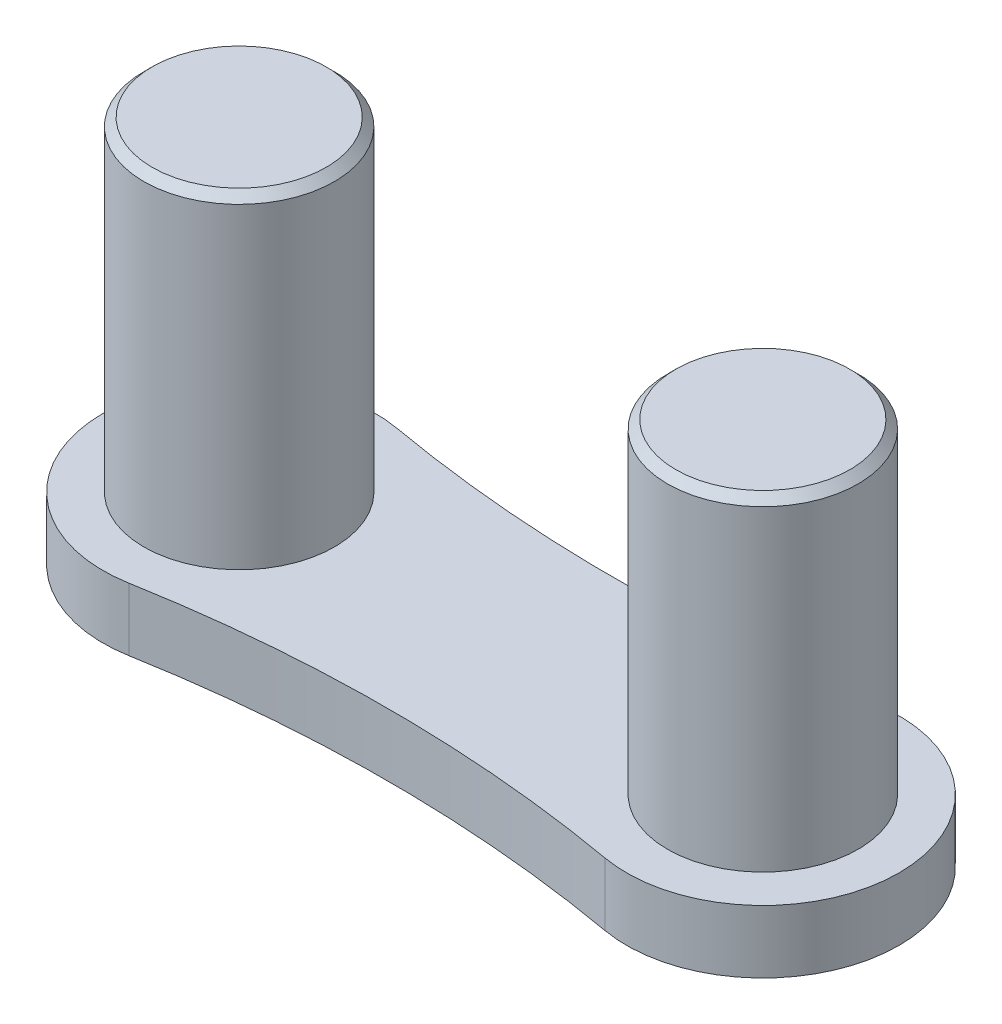
ISO-10303-21;
HEADER;
FILE_DESCRIPTION(('STEP AP214'),'2;1');
FILE_NAME('part.step','',(''),(''),'','','');
FILE_SCHEMA(('AUTOMOTIVE_DESIGN { 1 0 10303 214 1 1 1 1 }'));
ENDSEC;
DATA;
#1=APPLICATION_CONTEXT('core data for automotive mechanical design processes');
#2=APPLICATION_PROTOCOL_DEFINITION('international standard','automotive_design',2000,#1);
#3=PRODUCT_CONTEXT('',#1,'mechanical');
#4=PRODUCT('Part','Part','',(#3));
#5=PRODUCT_RELATED_PRODUCT_CATEGORY('part','',(#4));
#6=PRODUCT_DEFINITION_FORMATION('','',#4);
#7=PRODUCT_DEFINITION_CONTEXT('part definition',#1,'design');
#8=PRODUCT_DEFINITION('design','',#6,#7);
#9=PRODUCT_DEFINITION_SHAPE('','',#8);
#10=(LENGTH_UNIT() NAMED_UNIT(*) SI_UNIT(.MILLI.,.METRE.));
#11=(NAMED_UNIT(*) PLANE_ANGLE_UNIT() SI_UNIT($,.RADIAN.));
#12=(NAMED_UNIT(*) SI_UNIT($,.STERADIAN.) SOLID_ANGLE_UNIT());
#13=UNCERTAINTY_MEASURE_WITH_UNIT(LENGTH_MEASURE(1.E-05),#10,'distance_accuracy_value','');
#14=(GEOMETRIC_REPRESENTATION_CONTEXT(3) GLOBAL_UNCERTAINTY_ASSIGNED_CONTEXT((#13)) GLOBAL_UNIT_ASSIGNED_CONTEXT((#10,
#11,#12)) REPRESENTATION_CONTEXT('',''));
#15=CARTESIAN_POINT('',(0.,0.,0.));
#16=DIRECTION('',(0.,0.,1.));
#17=DIRECTION('',(1.,0.,0.));
#18=AXIS2_PLACEMENT_3D('',#15,#16,#17);
#19=CARTESIAN_POINT('',(0.,0.762,17.8813113613068));
#20=DIRECTION('',(0.,-1.,0.));
#21=DIRECTION('',(0.,0.,-1.));
#22=AXIS2_PLACEMENT_3D('',#19,#20,#21);
#23=CYLINDRICAL_SURFACE('',#22,16.51);
#24=CARTESIAN_POINT('',(0.,0.,17.8813113613068));
#25=DIRECTION('',(0.,-1.,0.));
#26=DIRECTION('',(0.,0.,1.));
#27=AXIS2_PLACEMENT_3D('',#24,#25,#26);
#28=CIRCLE('',#27,16.51);
#29=CARTESIAN_POINT('',(-2.88636363636364,0.,1.6255737601188));
#30=VERTEX_POINT('',#29);
#31=CARTESIAN_POINT('',(2.88636363636364,0.,1.6255737601188));
#32=VERTEX_POINT('',#31);
#33=EDGE_CURVE('E116',#30,#32,#28,.T.);
#34=ORIENTED_EDGE('',*,*,#33,.T.);
#35=DIRECTION('',(0.,-1.,0.));
#36=VECTOR('',#35,1.);
#37=CARTESIAN_POINT('',(2.88636363636364,0.762,1.6255737601188));
#38=LINE('',#37,#36);
#39=CARTESIAN_POINT('',(2.88636363636364,0.762,1.6255737601188));
#40=VERTEX_POINT('',#39);
#41=EDGE_CURVE('E105',#40,#32,#38,.T.);
#42=ORIENTED_EDGE('',*,*,#41,.F.);
#43=CARTESIAN_POINT('',(0.,0.762,17.8813113613068));
#44=DIRECTION('',(0.,-1.,0.));
#45=DIRECTION('',(0.,0.,1.));
#46=AXIS2_PLACEMENT_3D('',#43,#44,#45);
#47=CIRCLE('',#46,16.51);
#48=CARTESIAN_POINT('',(-2.88636363636364,0.762,1.6255737601188));
#49=VERTEX_POINT('',#48);
#50=EDGE_CURVE('E97',#49,#40,#47,.T.);
#51=ORIENTED_EDGE('',*,*,#50,.F.);
#52=DIRECTION('',(0.,-1.,0.));
#53=VECTOR('',#52,1.);
#54=CARTESIAN_POINT('',(-2.88636363636364,0.762,1.6255737601188));
#55=LINE('',#54,#53);
#56=EDGE_CURVE('E112',#49,#30,#55,.T.);
#57=ORIENTED_EDGE('',*,*,#56,.T.);
#58=EDGE_LOOP('',(#34,#42,#51,#57));
#59=FACE_BOUND('',#58,.T.);
#60=ADVANCED_FACE('F42',(#59),#23,.F.);
#61=CARTESIAN_POINT('',(3.175,0.762,0.));
#62=DIRECTION('',(0.,-1.,0.));
#63=DIRECTION('',(0.,0.,-1.));
#64=AXIS2_PLACEMENT_3D('',#61,#62,#63);
#65=CYLINDRICAL_SURFACE('',#64,1.651);
#66=CARTESIAN_POINT('',(3.175,0.,0.));
#67=DIRECTION('',(0.,1.,0.));
#68=DIRECTION('',(0.,0.,1.));
#69=AXIS2_PLACEMENT_3D('',#66,#67,#68);
#70=CIRCLE('',#69,1.651);
#71=CARTESIAN_POINT('',(2.88636363636364,0.,-1.6255737601188));
#72=VERTEX_POINT('',#71);
#73=EDGE_CURVE('E103',#32,#72,#70,.T.);
#74=ORIENTED_EDGE('',*,*,#73,.T.);
#75=DIRECTION('',(0.,-1.,0.));
#76=VECTOR('',#75,1.);
#77=CARTESIAN_POINT('',(2.88636363636364,0.762,-1.6255737601188));
#78=LINE('',#77,#76);
#79=CARTESIAN_POINT('',(2.88636363636364,0.762,-1.6255737601188));
#80=VERTEX_POINT('',#79);
#81=EDGE_CURVE('E101',#80,#72,#78,.T.);
#82=ORIENTED_EDGE('',*,*,#81,.F.);
#83=CARTESIAN_POINT('',(3.175,0.762,0.));
#84=DIRECTION('',(0.,1.,0.));
#85=DIRECTION('',(0.,0.,1.));
#86=AXIS2_PLACEMENT_3D('',#83,#84,#85);
#87=CIRCLE('',#86,1.651);
#88=EDGE_CURVE('E92',#40,#80,#87,.T.);
#89=ORIENTED_EDGE('',*,*,#88,.F.);
#90=ORIENTED_EDGE('',*,*,#41,.T.);
#91=EDGE_LOOP('',(#74,#82,#89,#90));
#92=FACE_BOUND('',#91,.T.);
#93=ADVANCED_FACE('F102',(#92),#65,.T.);
#94=CARTESIAN_POINT('',(0.,0.762,-17.8813113613068));
#95=DIRECTION('',(0.,-1.,0.));
#96=DIRECTION('',(0.,0.,-1.));
#97=AXIS2_PLACEMENT_3D('',#94,#95,#96);
#98=CYLINDRICAL_SURFACE('',#97,16.51);
#99=CARTESIAN_POINT('',(0.,0.,-17.8813113613068));
#100=DIRECTION('',(0.,-1.,0.));
#101=DIRECTION('',(0.,0.,1.));
#102=AXIS2_PLACEMENT_3D('',#99,#100,#101);
#103=CIRCLE('',#102,16.51);
#104=CARTESIAN_POINT('',(-2.88636363636364,0.,-1.6255737601188));
#105=VERTEX_POINT('',#104);
#106=EDGE_CURVE('E78',#72,#105,#103,.T.);
#107=ORIENTED_EDGE('',*,*,#106,.T.);
#108=DIRECTION('',(0.,-1.,0.));
#109=VECTOR('',#108,1.);
#110=CARTESIAN_POINT('',(-2.88636363636364,0.762,-1.6255737601188));
#111=LINE('',#110,#109);
#112=CARTESIAN_POINT('',(-2.88636363636364,0.762,-1.6255737601188));
#113=VERTEX_POINT('',#112);
#114=EDGE_CURVE('E106',#113,#105,#111,.T.);
#115=ORIENTED_EDGE('',*,*,#114,.F.);
#116=CARTESIAN_POINT('',(0.,0.762,-17.8813113613068));
#117=DIRECTION('',(0.,-1.,0.));
#118=DIRECTION('',(0.,0.,1.));
#119=AXIS2_PLACEMENT_3D('',#116,#117,#118);
#120=CIRCLE('',#119,16.51);
#121=EDGE_CURVE('E95',#80,#113,#120,.T.);
#122=ORIENTED_EDGE('',*,*,#121,.F.);
#123=ORIENTED_EDGE('',*,*,#81,.T.);
#124=EDGE_LOOP('',(#107,#115,#122,#123));
#125=FACE_BOUND('',#124,.T.);
#126=ADVANCED_FACE('F108',(#125),#98,.F.);
#127=CARTESIAN_POINT('',(-3.175,0.762,0.));
#128=DIRECTION('',(0.,-1.,0.));
#129=DIRECTION('',(0.,0.,-1.));
#130=AXIS2_PLACEMENT_3D('',#127,#128,#129);
#131=CYLINDRICAL_SURFACE('',#130,1.651);
#132=CARTESIAN_POINT('',(-3.175,0.,0.));
#133=DIRECTION('',(0.,1.,0.));
#134=DIRECTION('',(0.,0.,1.));
#135=AXIS2_PLACEMENT_3D('',#132,#133,#134);
#136=CIRCLE('',#135,1.651);
#137=EDGE_CURVE('E84',#105,#30,#136,.T.);
#138=ORIENTED_EDGE('',*,*,#137,.T.);
#139=ORIENTED_EDGE('',*,*,#56,.F.);
#140=CARTESIAN_POINT('',(-3.175,0.762,0.));
#141=DIRECTION('',(0.,1.,0.));
#142=DIRECTION('',(0.,0.,1.));
#143=AXIS2_PLACEMENT_3D('',#140,#141,#142);
#144=CIRCLE('',#143,1.651);
#145=EDGE_CURVE('E61',#113,#49,#144,.T.);
#146=ORIENTED_EDGE('',*,*,#145,.F.);
#147=ORIENTED_EDGE('',*,*,#114,.T.);
#148=EDGE_LOOP('',(#138,#139,#146,#147));
#149=FACE_BOUND('',#148,.T.);
#150=ADVANCED_FACE('F170',(#149),#131,.T.);
#151=CARTESIAN_POINT('',(-1.5875,0.762,8.9406556806534));
#152=DIRECTION('',(0.,1.,0.));
#153=DIRECTION('',(0.,0.,1.));
#154=AXIS2_PLACEMENT_3D('',#151,#152,#153);
#155=PLANE('',#154);
#156=CARTESIAN_POINT('',(3.175,0.762,0.));
#157=DIRECTION('',(0.,1.,0.));
#158=DIRECTION('',(0.,0.,1.));
#159=AXIS2_PLACEMENT_3D('',#156,#157,#158);
#160=CIRCLE('',#159,1.1557);
#161=CARTESIAN_POINT('',(3.175,0.762,1.1557));
#162=VERTEX_POINT('',#161);
#163=EDGE_CURVE('E266',#162,#162,#160,.T.);
#164=ORIENTED_EDGE('',*,*,#163,.F.);
#165=EDGE_LOOP('',(#164));
#166=FACE_BOUND('',#165,.T.);
#167=CARTESIAN_POINT('',(-3.175,0.762,0.));
#168=DIRECTION('',(0.,1.,0.));
#169=DIRECTION('',(0.,0.,1.));
#170=AXIS2_PLACEMENT_3D('',#167,#168,#169);
#171=CIRCLE('',#170,1.1557);
#172=CARTESIAN_POINT('',(-3.175,0.762,1.1557));
#173=VERTEX_POINT('',#172);
#174=EDGE_CURVE('E120',#173,#173,#171,.T.);
#175=ORIENTED_EDGE('',*,*,#174,.F.);
#176=EDGE_LOOP('',(#175));
#177=FACE_BOUND('',#176,.T.);
#178=ORIENTED_EDGE('',*,*,#50,.T.);
#179=ORIENTED_EDGE('',*,*,#88,.T.);
#180=ORIENTED_EDGE('',*,*,#121,.T.);
#181=ORIENTED_EDGE('',*,*,#145,.T.);
#182=EDGE_LOOP('',(#178,#179,#180,#181));
#183=FACE_BOUND('',#182,.T.);
#184=ADVANCED_FACE('F93',(#166,#177,#183),#155,.T.);
#185=CARTESIAN_POINT('',(-1.5875,0.,8.9406556806534));
#186=DIRECTION('',(0.,1.,0.));
#187=DIRECTION('',(0.,0.,1.));
#188=AXIS2_PLACEMENT_3D('',#185,#186,#187);
#189=PLANE('',#188);
#190=ORIENTED_EDGE('',*,*,#33,.F.);
#191=ORIENTED_EDGE('',*,*,#137,.F.);
#192=ORIENTED_EDGE('',*,*,#106,.F.);
#193=ORIENTED_EDGE('',*,*,#73,.F.);
#194=EDGE_LOOP('',(#190,#191,#192,#193));
#195=FACE_BOUND('',#194,.T.);
#196=ADVANCED_FACE('F173',(#195),#189,.F.);
#197=CARTESIAN_POINT('',(-3.175,4.699,0.));
#198=DIRECTION('',(0.,-1.,0.));
#199=DIRECTION('',(0.,0.,-1.));
#200=AXIS2_PLACEMENT_3D('',#197,#198,#199);
#201=CYLINDRICAL_SURFACE('',#200,1.1557);
#202=CARTESIAN_POINT('',(-3.175,4.599,0.));
#203=DIRECTION('',(0.,1.,0.));
#204=DIRECTION('',(0.,0.,1.));
#205=AXIS2_PLACEMENT_3D('',#202,#203,#204);
#206=CIRCLE('',#205,1.1557);
#207=CARTESIAN_POINT('',(-3.175,4.599,1.1557));
#208=VERTEX_POINT('',#207);
#209=EDGE_CURVE('E11',#208,#208,#206,.F.);
#210=ORIENTED_EDGE('',*,*,#209,.T.);
#211=EDGE_LOOP('',(#210));
#212=FACE_BOUND('',#211,.T.);
#213=ORIENTED_EDGE('',*,*,#174,.T.);
#214=EDGE_LOOP('',(#213));
#215=FACE_BOUND('',#214,.T.);
#216=ADVANCED_FACE('F176',(#212,#215),#201,.T.);
#217=CARTESIAN_POINT('',(-3.175,4.699,0.));
#218=DIRECTION('',(0.,1.,0.));
#219=DIRECTION('',(0.,0.,1.));
#220=AXIS2_PLACEMENT_3D('',#217,#218,#219);
#221=PLANE('',#220);
#222=CARTESIAN_POINT('',(-3.175,4.699,0.));
#223=DIRECTION('',(0.,1.,0.));
#224=DIRECTION('',(0.,0.,1.));
#225=AXIS2_PLACEMENT_3D('',#222,#223,#224);
#226=CIRCLE('',#225,1.0557);
#227=CARTESIAN_POINT('',(-3.175,4.699,1.0557));
#228=VERTEX_POINT('',#227);
#229=EDGE_CURVE('E53',#228,#228,#226,.T.);
#230=ORIENTED_EDGE('',*,*,#229,.T.);
#231=EDGE_LOOP('',(#230));
#232=FACE_BOUND('',#231,.T.);
#233=ADVANCED_FACE('F144',(#232),#221,.T.);
#234=CARTESIAN_POINT('',(3.175,4.699,0.));
#235=DIRECTION('',(0.,-1.,0.));
#236=DIRECTION('',(0.,0.,-1.));
#237=AXIS2_PLACEMENT_3D('',#234,#235,#236);
#238=CYLINDRICAL_SURFACE('',#237,1.1557);
#239=CARTESIAN_POINT('',(3.175,4.599,0.));
#240=DIRECTION('',(0.,1.,0.));
#241=DIRECTION('',(0.,0.,1.));
#242=AXIS2_PLACEMENT_3D('',#239,#240,#241);
#243=CIRCLE('',#242,1.1557);
#244=CARTESIAN_POINT('',(3.175,4.599,1.1557));
#245=VERTEX_POINT('',#244);
#246=EDGE_CURVE('E137',#245,#245,#243,.F.);
#247=ORIENTED_EDGE('',*,*,#246,.T.);
#248=EDGE_LOOP('',(#247));
#249=FACE_BOUND('',#248,.T.);
#250=ORIENTED_EDGE('',*,*,#163,.T.);
#251=EDGE_LOOP('',(#250));
#252=FACE_BOUND('',#251,.T.);
#253=ADVANCED_FACE('F186',(#249,#252),#238,.T.);
#254=CARTESIAN_POINT('',(3.175,4.699,0.));
#255=DIRECTION('',(0.,1.,0.));
#256=DIRECTION('',(0.,0.,1.));
#257=AXIS2_PLACEMENT_3D('',#254,#255,#256);
#258=PLANE('',#257);
#259=CARTESIAN_POINT('',(3.175,4.699,0.));
#260=DIRECTION('',(0.,1.,0.));
#261=DIRECTION('',(0.,0.,1.));
#262=AXIS2_PLACEMENT_3D('',#259,#260,#261);
#263=CIRCLE('',#262,1.0557);
#264=CARTESIAN_POINT('',(3.175,4.699,1.0557));
#265=VERTEX_POINT('',#264);
#266=EDGE_CURVE('E133',#265,#265,#263,.T.);
#267=ORIENTED_EDGE('',*,*,#266,.T.);
#268=EDGE_LOOP('',(#267));
#269=FACE_BOUND('',#268,.T.);
#270=ADVANCED_FACE('F152',(#269),#258,.T.);
#271=CARTESIAN_POINT('',(3.175,4.699,0.));
#272=DIRECTION('',(0.,-1.,0.));
#273=DIRECTION('',(0.,0.,-1.));
#274=AXIS2_PLACEMENT_3D('',#271,#272,#273);
#275=CONICAL_SURFACE('',#274,1.0557,0.785398163397442);
#276=ORIENTED_EDGE('',*,*,#246,.F.);
#277=EDGE_LOOP('',(#276));
#278=FACE_BOUND('',#277,.T.);
#279=ORIENTED_EDGE('',*,*,#266,.F.);
#280=EDGE_LOOP('',(#279));
#281=FACE_BOUND('',#280,.T.);
#282=ADVANCED_FACE('F147',(#278,#281),#275,.T.);
#283=CARTESIAN_POINT('',(-3.175,4.699,0.));
#284=DIRECTION('',(0.,-1.,0.));
#285=DIRECTION('',(0.,0.,-1.));
#286=AXIS2_PLACEMENT_3D('',#283,#284,#285);
#287=CONICAL_SURFACE('',#286,1.0557,0.785398163397445);
#288=ORIENTED_EDGE('',*,*,#209,.F.);
#289=EDGE_LOOP('',(#288));
#290=FACE_BOUND('',#289,.T.);
#291=ORIENTED_EDGE('',*,*,#229,.F.);
#292=EDGE_LOOP('',(#291));
#293=FACE_BOUND('',#292,.T.);
#294=ADVANCED_FACE('F45',(#290,#293),#287,.T.);
#295=CLOSED_SHELL('',(#60,#93,#126,#150,#184,#196,#216,#233,#253,#270,#282,#294));
#296=MANIFOLD_SOLID_BREP('B2',#295);
#297=ADVANCED_BREP_SHAPE_REPRESENTATION('',(#18,#296),#14);
#298=SHAPE_DEFINITION_REPRESENTATION(#9,#297);
ENDSEC;
END-ISO-10303-21;
